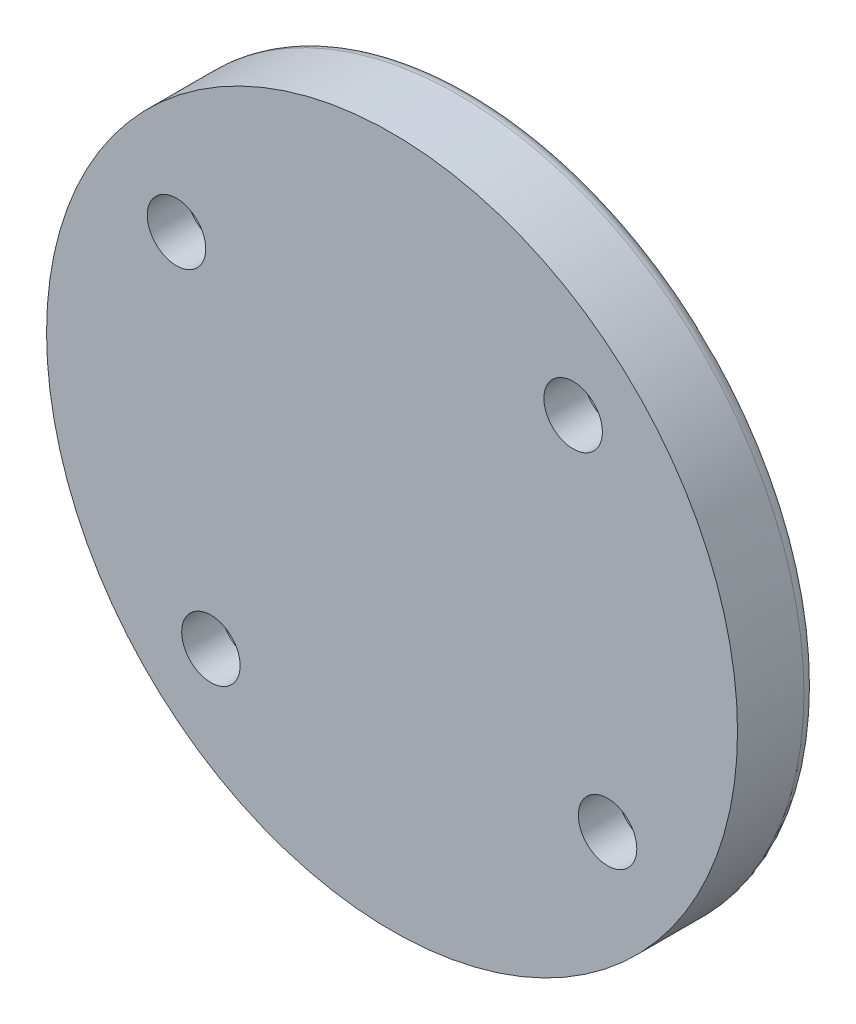
ISO-10303-21;
HEADER;
FILE_DESCRIPTION(('STEP AP214'),'2;1');
FILE_NAME('part.step','',(''),(''),'','','');
FILE_SCHEMA(('AUTOMOTIVE_DESIGN { 1 0 10303 214 1 1 1 1 }'));
ENDSEC;
DATA;
#1=APPLICATION_CONTEXT('core data for automotive mechanical design processes');
#2=APPLICATION_PROTOCOL_DEFINITION('international standard','automotive_design',2000,#1);
#3=PRODUCT_CONTEXT('',#1,'mechanical');
#4=PRODUCT('Part','Part','',(#3));
#5=PRODUCT_RELATED_PRODUCT_CATEGORY('part','',(#4));
#6=PRODUCT_DEFINITION_FORMATION('','',#4);
#7=PRODUCT_DEFINITION_CONTEXT('part definition',#1,'design');
#8=PRODUCT_DEFINITION('design','',#6,#7);
#9=PRODUCT_DEFINITION_SHAPE('','',#8);
#10=(LENGTH_UNIT() NAMED_UNIT(*) SI_UNIT(.MILLI.,.METRE.));
#11=(NAMED_UNIT(*) PLANE_ANGLE_UNIT() SI_UNIT($,.RADIAN.));
#12=(NAMED_UNIT(*) SI_UNIT($,.STERADIAN.) SOLID_ANGLE_UNIT());
#13=UNCERTAINTY_MEASURE_WITH_UNIT(LENGTH_MEASURE(1.E-05),#10,'distance_accuracy_value','');
#14=(GEOMETRIC_REPRESENTATION_CONTEXT(3) GLOBAL_UNCERTAINTY_ASSIGNED_CONTEXT((#13)) GLOBAL_UNIT_ASSIGNED_CONTEXT((#10,
#11,#12)) REPRESENTATION_CONTEXT('',''));
#15=CARTESIAN_POINT('',(0.,0.,0.));
#16=DIRECTION('',(0.,0.,1.));
#17=DIRECTION('',(1.,0.,0.));
#18=AXIS2_PLACEMENT_3D('',#15,#16,#17);
#19=CARTESIAN_POINT('',(59.9551309247938,-364.997907801492,3.));
#20=DIRECTION('',(0.,0.,-1.));
#21=DIRECTION('',(-1.,0.,0.));
#22=AXIS2_PLACEMENT_3D('',#19,#20,#21);
#23=CYLINDRICAL_SURFACE('',#22,1.10000000000004);
#24=CARTESIAN_POINT('',(59.9551309247938,-364.997907801492,3.));
#25=DIRECTION('',(0.,0.,1.));
#26=DIRECTION('',(1.,0.,0.));
#27=AXIS2_PLACEMENT_3D('',#24,#25,#26);
#28=CIRCLE('',#27,1.10000000000004);
#29=CARTESIAN_POINT('',(61.0551309247938,-364.997907801492,3.));
#30=VERTEX_POINT('',#29);
#31=EDGE_CURVE('E84',#30,#30,#28,.T.);
#32=ORIENTED_EDGE('',*,*,#31,.T.);
#33=EDGE_LOOP('',(#32));
#34=FACE_BOUND('',#33,.T.);
#35=CARTESIAN_POINT('',(59.9551309247938,-364.997907801492,1.5));
#36=DIRECTION('',(0.,0.,-1.));
#37=DIRECTION('',(-1.,0.,0.));
#38=AXIS2_PLACEMENT_3D('',#35,#36,#37);
#39=CIRCLE('',#38,1.10000000000004);
#40=CARTESIAN_POINT('',(58.8551309247938,-364.997907801492,1.5));
#41=VERTEX_POINT('',#40);
#42=EDGE_CURVE('E43',#41,#41,#39,.T.);
#43=ORIENTED_EDGE('',*,*,#42,.T.);
#44=EDGE_LOOP('',(#43));
#45=FACE_BOUND('',#44,.T.);
#46=ADVANCED_FACE('F39',(#34,#45),#23,.F.);
#47=CARTESIAN_POINT('',(74.8805104645125,-363.503569956376,3.));
#48=DIRECTION('',(0.,0.,-1.));
#49=DIRECTION('',(-1.,0.,0.));
#50=AXIS2_PLACEMENT_3D('',#47,#48,#49);
#51=CYLINDRICAL_SURFACE('',#50,1.10000000000008);
#52=CARTESIAN_POINT('',(74.8805104645125,-363.503569956376,3.));
#53=DIRECTION('',(0.,0.,1.));
#54=DIRECTION('',(1.,0.,0.));
#55=AXIS2_PLACEMENT_3D('',#52,#53,#54);
#56=CIRCLE('',#55,1.10000000000008);
#57=CARTESIAN_POINT('',(75.9805104645125,-363.503569956376,3.));
#58=VERTEX_POINT('',#57);
#59=EDGE_CURVE('E76',#58,#58,#56,.T.);
#60=ORIENTED_EDGE('',*,*,#59,.T.);
#61=EDGE_LOOP('',(#60));
#62=FACE_BOUND('',#61,.T.);
#63=CARTESIAN_POINT('',(74.8805104645125,-363.503569956376,1.5));
#64=DIRECTION('',(0.,0.,-1.));
#65=DIRECTION('',(-1.,0.,0.));
#66=AXIS2_PLACEMENT_3D('',#63,#64,#65);
#67=CIRCLE('',#66,1.10000000000008);
#68=CARTESIAN_POINT('',(73.7805104645124,-363.503569956376,1.5));
#69=VERTEX_POINT('',#68);
#70=EDGE_CURVE('E62',#69,#69,#67,.T.);
#71=ORIENTED_EDGE('',*,*,#70,.T.);
#72=EDGE_LOOP('',(#71));
#73=FACE_BOUND('',#72,.T.);
#74=ADVANCED_FACE('F106',(#62,#73),#51,.F.);
#75=CARTESIAN_POINT('',(58.6600381256929,-352.062578867069,3.));
#76=DIRECTION('',(0.,0.,-1.));
#77=DIRECTION('',(-1.,0.,0.));
#78=AXIS2_PLACEMENT_3D('',#75,#76,#77);
#79=CYLINDRICAL_SURFACE('',#78,1.09999999999998);
#80=CARTESIAN_POINT('',(58.6600381256929,-352.062578867069,3.));
#81=DIRECTION('',(0.,0.,1.));
#82=DIRECTION('',(1.,0.,0.));
#83=AXIS2_PLACEMENT_3D('',#80,#81,#82);
#84=CIRCLE('',#83,1.09999999999998);
#85=CARTESIAN_POINT('',(59.7600381256929,-352.062578867069,3.));
#86=VERTEX_POINT('',#85);
#87=EDGE_CURVE('E71',#86,#86,#84,.T.);
#88=ORIENTED_EDGE('',*,*,#87,.T.);
#89=EDGE_LOOP('',(#88));
#90=FACE_BOUND('',#89,.T.);
#91=CARTESIAN_POINT('',(58.6600381256929,-352.062578867069,1.5));
#92=DIRECTION('',(0.,0.,-1.));
#93=DIRECTION('',(-1.,0.,0.));
#94=AXIS2_PLACEMENT_3D('',#91,#92,#93);
#95=CIRCLE('',#94,1.09999999999998);
#96=CARTESIAN_POINT('',(57.5600381256929,-352.062578867069,1.5));
#97=VERTEX_POINT('',#96);
#98=EDGE_CURVE('E59',#97,#97,#95,.T.);
#99=ORIENTED_EDGE('',*,*,#98,.T.);
#100=EDGE_LOOP('',(#99));
#101=FACE_BOUND('',#100,.T.);
#102=ADVANCED_FACE('F112',(#90,#101),#79,.F.);
#103=CARTESIAN_POINT('',(73.5854176654116,-350.568241021953,3.));
#104=DIRECTION('',(0.,0.,-1.));
#105=DIRECTION('',(-1.,0.,0.));
#106=AXIS2_PLACEMENT_3D('',#103,#104,#105);
#107=CYLINDRICAL_SURFACE('',#106,1.10000000000004);
#108=CARTESIAN_POINT('',(73.5854176654116,-350.568241021953,3.));
#109=DIRECTION('',(0.,0.,1.));
#110=DIRECTION('',(1.,0.,0.));
#111=AXIS2_PLACEMENT_3D('',#108,#109,#110);
#112=CIRCLE('',#111,1.10000000000004);
#113=CARTESIAN_POINT('',(74.6854176654116,-350.568241021953,3.));
#114=VERTEX_POINT('',#113);
#115=EDGE_CURVE('E67',#114,#114,#112,.T.);
#116=ORIENTED_EDGE('',*,*,#115,.T.);
#117=EDGE_LOOP('',(#116));
#118=FACE_BOUND('',#117,.T.);
#119=CARTESIAN_POINT('',(73.5854176654116,-350.568241021953,1.5));
#120=DIRECTION('',(0.,0.,-1.));
#121=DIRECTION('',(-1.,0.,0.));
#122=AXIS2_PLACEMENT_3D('',#119,#120,#121);
#123=CIRCLE('',#122,1.10000000000004);
#124=CARTESIAN_POINT('',(72.4854176654116,-350.568241021953,1.5));
#125=VERTEX_POINT('',#124);
#126=EDGE_CURVE('E56',#125,#125,#123,.T.);
#127=ORIENTED_EDGE('',*,*,#126,.T.);
#128=EDGE_LOOP('',(#127));
#129=FACE_BOUND('',#128,.T.);
#130=ADVANCED_FACE('F117',(#118,#129),#107,.F.);
#131=CARTESIAN_POINT('',(66.7702742951027,-357.783074411722,3.));
#132=DIRECTION('',(0.,0.,1.));
#133=DIRECTION('',(1.,0.,0.));
#134=AXIS2_PLACEMENT_3D('',#131,#132,#133);
#135=PLANE('',#134);
#136=ORIENTED_EDGE('',*,*,#87,.F.);
#137=EDGE_LOOP('',(#136));
#138=FACE_BOUND('',#137,.T.);
#139=ORIENTED_EDGE('',*,*,#31,.F.);
#140=EDGE_LOOP('',(#139));
#141=FACE_BOUND('',#140,.T.);
#142=CARTESIAN_POINT('',(66.7702742951027,-357.783074411722,3.));
#143=DIRECTION('',(0.,0.,1.));
#144=DIRECTION('',(1.,0.,0.));
#145=AXIS2_PLACEMENT_3D('',#142,#143,#144);
#146=CIRCLE('',#145,13.);
#147=CARTESIAN_POINT('',(79.7702742951028,-357.783074411722,3.));
#148=VERTEX_POINT('',#147);
#149=EDGE_CURVE('E52',#148,#148,#146,.T.);
#150=ORIENTED_EDGE('',*,*,#149,.T.);
#151=EDGE_LOOP('',(#150));
#152=FACE_BOUND('',#151,.T.);
#153=ORIENTED_EDGE('',*,*,#59,.F.);
#154=EDGE_LOOP('',(#153));
#155=FACE_BOUND('',#154,.T.);
#156=ORIENTED_EDGE('',*,*,#115,.F.);
#157=EDGE_LOOP('',(#156));
#158=FACE_BOUND('',#157,.T.);
#159=ADVANCED_FACE('F89',(#138,#141,#152,#155,#158),#135,.T.);
#160=CARTESIAN_POINT('',(66.7702742951027,-357.783074411722,0.));
#161=DIRECTION('',(0.,0.,1.));
#162=DIRECTION('',(1.,0.,0.));
#163=AXIS2_PLACEMENT_3D('',#160,#161,#162);
#164=PLANE('',#163);
#165=CARTESIAN_POINT('',(74.8805104645125,-363.503569956376,0.));
#166=DIRECTION('',(0.,0.,-1.));
#167=DIRECTION('',(-1.,0.,0.));
#168=AXIS2_PLACEMENT_3D('',#165,#166,#167);
#169=CIRCLE('',#168,2.35);
#170=CARTESIAN_POINT('',(72.5305104645125,-363.503569956376,0.));
#171=VERTEX_POINT('',#170);
#172=EDGE_CURVE('E152',#171,#171,#169,.T.);
#173=ORIENTED_EDGE('',*,*,#172,.F.);
#174=EDGE_LOOP('',(#173));
#175=FACE_BOUND('',#174,.T.);
#176=CARTESIAN_POINT('',(59.9551309247938,-364.997907801492,0.));
#177=DIRECTION('',(0.,0.,-1.));
#178=DIRECTION('',(-1.,0.,0.));
#179=AXIS2_PLACEMENT_3D('',#176,#177,#178);
#180=CIRCLE('',#179,2.34999999999999);
#181=CARTESIAN_POINT('',(57.6051309247938,-364.997907801492,0.));
#182=VERTEX_POINT('',#181);
#183=EDGE_CURVE('E142',#182,#182,#180,.T.);
#184=ORIENTED_EDGE('',*,*,#183,.F.);
#185=EDGE_LOOP('',(#184));
#186=FACE_BOUND('',#185,.T.);
#187=CARTESIAN_POINT('',(58.6600381256929,-352.062578867069,0.));
#188=DIRECTION('',(0.,0.,-1.));
#189=DIRECTION('',(-1.,0.,0.));
#190=AXIS2_PLACEMENT_3D('',#187,#188,#189);
#191=CIRCLE('',#190,2.34999999999998);
#192=CARTESIAN_POINT('',(56.3100381256929,-352.062578867069,0.));
#193=VERTEX_POINT('',#192);
#194=EDGE_CURVE('E141',#193,#193,#191,.T.);
#195=ORIENTED_EDGE('',*,*,#194,.F.);
#196=EDGE_LOOP('',(#195));
#197=FACE_BOUND('',#196,.T.);
#198=CARTESIAN_POINT('',(73.5854176654116,-350.568241021953,0.));
#199=DIRECTION('',(0.,0.,-1.));
#200=DIRECTION('',(-1.,0.,0.));
#201=AXIS2_PLACEMENT_3D('',#198,#199,#200);
#202=CIRCLE('',#201,2.35);
#203=CARTESIAN_POINT('',(71.2354176654116,-350.568241021953,0.));
#204=VERTEX_POINT('',#203);
#205=EDGE_CURVE('E79',#204,#204,#202,.T.);
#206=ORIENTED_EDGE('',*,*,#205,.F.);
#207=EDGE_LOOP('',(#206));
#208=FACE_BOUND('',#207,.T.);
#209=CARTESIAN_POINT('',(66.7702742951027,-357.783074411722,0.));
#210=DIRECTION('',(0.,0.,1.));
#211=DIRECTION('',(1.,0.,0.));
#212=AXIS2_PLACEMENT_3D('',#209,#210,#211);
#213=CIRCLE('',#212,12.5);
#214=CARTESIAN_POINT('',(79.2702742951028,-357.783074411722,0.));
#215=VERTEX_POINT('',#214);
#216=EDGE_CURVE('E10',#215,#215,#213,.F.);
#217=ORIENTED_EDGE('',*,*,#216,.T.);
#218=EDGE_LOOP('',(#217));
#219=FACE_BOUND('',#218,.T.);
#220=ADVANCED_FACE('F94',(#175,#186,#197,#208,#219),#164,.F.);
#221=CARTESIAN_POINT('',(66.7702742951027,-357.783074411722,3.));
#222=DIRECTION('',(0.,0.,-1.));
#223=DIRECTION('',(-1.,0.,0.));
#224=AXIS2_PLACEMENT_3D('',#221,#222,#223);
#225=CYLINDRICAL_SURFACE('',#224,13.);
#226=CARTESIAN_POINT('',(66.7702742951027,-357.783074411722,0.5));
#227=DIRECTION('',(0.,0.,1.));
#228=DIRECTION('',(1.,0.,0.));
#229=AXIS2_PLACEMENT_3D('',#226,#227,#228);
#230=CIRCLE('',#229,13.);
#231=CARTESIAN_POINT('',(79.7702742951028,-357.783074411722,0.5));
#232=VERTEX_POINT('',#231);
#233=EDGE_CURVE('E47',#232,#232,#230,.T.);
#234=ORIENTED_EDGE('',*,*,#233,.T.);
#235=EDGE_LOOP('',(#234));
#236=FACE_BOUND('',#235,.T.);
#237=ORIENTED_EDGE('',*,*,#149,.F.);
#238=EDGE_LOOP('',(#237));
#239=FACE_BOUND('',#238,.T.);
#240=ADVANCED_FACE('F92',(#236,#239),#225,.T.);
#241=CARTESIAN_POINT('',(66.7702742951027,-357.783074411722,0.5));
#242=DIRECTION('',(0.,0.,1.));
#243=DIRECTION('',(1.,0.,0.));
#244=AXIS2_PLACEMENT_3D('',#241,#242,#243);
#245=TOROIDAL_SURFACE('',#244,12.5,0.5);
#246=ORIENTED_EDGE('',*,*,#216,.F.);
#247=EDGE_LOOP('',(#246));
#248=FACE_BOUND('',#247,.T.);
#249=ORIENTED_EDGE('',*,*,#233,.F.);
#250=EDGE_LOOP('',(#249));
#251=FACE_BOUND('',#250,.T.);
#252=ADVANCED_FACE('F41',(#248,#251),#245,.T.);
#253=CARTESIAN_POINT('',(73.5854176654116,-350.568241021953,1.5));
#254=DIRECTION('',(0.,0.,-1.));
#255=DIRECTION('',(-1.,0.,0.));
#256=AXIS2_PLACEMENT_3D('',#253,#254,#255);
#257=CYLINDRICAL_SURFACE('',#256,2.35);
#258=CARTESIAN_POINT('',(73.5854176654116,-350.568241021953,1.5));
#259=DIRECTION('',(0.,0.,-1.));
#260=DIRECTION('',(-1.,0.,0.));
#261=AXIS2_PLACEMENT_3D('',#258,#259,#260);
#262=CIRCLE('',#261,2.35);
#263=CARTESIAN_POINT('',(71.2354176654116,-350.568241021953,1.5));
#264=VERTEX_POINT('',#263);
#265=EDGE_CURVE('E60',#264,#264,#262,.T.);
#266=ORIENTED_EDGE('',*,*,#265,.F.);
#267=EDGE_LOOP('',(#266));
#268=FACE_BOUND('',#267,.T.);
#269=ORIENTED_EDGE('',*,*,#205,.T.);
#270=EDGE_LOOP('',(#269));
#271=FACE_BOUND('',#270,.T.);
#272=ADVANCED_FACE('F100',(#268,#271),#257,.F.);
#273=CARTESIAN_POINT('',(73.5854176654116,-350.568241021953,1.5));
#274=DIRECTION('',(0.,0.,-1.));
#275=DIRECTION('',(-1.,0.,0.));
#276=AXIS2_PLACEMENT_3D('',#273,#274,#275);
#277=PLANE('',#276);
#278=ORIENTED_EDGE('',*,*,#126,.F.);
#279=EDGE_LOOP('',(#278));
#280=FACE_BOUND('',#279,.T.);
#281=ORIENTED_EDGE('',*,*,#265,.T.);
#282=EDGE_LOOP('',(#281));
#283=FACE_BOUND('',#282,.T.);
#284=ADVANCED_FACE('F165',(#280,#283),#277,.T.);
#285=CARTESIAN_POINT('',(58.6600381256929,-352.062578867069,1.5));
#286=DIRECTION('',(0.,0.,-1.));
#287=DIRECTION('',(-1.,0.,0.));
#288=AXIS2_PLACEMENT_3D('',#285,#286,#287);
#289=CYLINDRICAL_SURFACE('',#288,2.34999999999998);
#290=CARTESIAN_POINT('',(58.6600381256929,-352.062578867069,1.5));
#291=DIRECTION('',(0.,0.,-1.));
#292=DIRECTION('',(-1.,0.,0.));
#293=AXIS2_PLACEMENT_3D('',#290,#291,#292);
#294=CIRCLE('',#293,2.34999999999998);
#295=CARTESIAN_POINT('',(56.3100381256929,-352.062578867069,1.5));
#296=VERTEX_POINT('',#295);
#297=EDGE_CURVE('E139',#296,#296,#294,.T.);
#298=ORIENTED_EDGE('',*,*,#297,.F.);
#299=EDGE_LOOP('',(#298));
#300=FACE_BOUND('',#299,.T.);
#301=ORIENTED_EDGE('',*,*,#194,.T.);
#302=EDGE_LOOP('',(#301));
#303=FACE_BOUND('',#302,.T.);
#304=ADVANCED_FACE('F135',(#300,#303),#289,.F.);
#305=CARTESIAN_POINT('',(58.6600381256929,-352.062578867069,1.5));
#306=DIRECTION('',(0.,0.,-1.));
#307=DIRECTION('',(-1.,0.,0.));
#308=AXIS2_PLACEMENT_3D('',#305,#306,#307);
#309=PLANE('',#308);
#310=ORIENTED_EDGE('',*,*,#98,.F.);
#311=EDGE_LOOP('',(#310));
#312=FACE_BOUND('',#311,.T.);
#313=ORIENTED_EDGE('',*,*,#297,.T.);
#314=EDGE_LOOP('',(#313));
#315=FACE_BOUND('',#314,.T.);
#316=ADVANCED_FACE('F131',(#312,#315),#309,.T.);
#317=CARTESIAN_POINT('',(74.8805104645125,-363.503569956376,1.5));
#318=DIRECTION('',(0.,0.,-1.));
#319=DIRECTION('',(-1.,0.,0.));
#320=AXIS2_PLACEMENT_3D('',#317,#318,#319);
#321=CYLINDRICAL_SURFACE('',#320,2.35);
#322=CARTESIAN_POINT('',(74.8805104645125,-363.503569956376,1.5));
#323=DIRECTION('',(0.,0.,-1.));
#324=DIRECTION('',(-1.,0.,0.));
#325=AXIS2_PLACEMENT_3D('',#322,#323,#324);
#326=CIRCLE('',#325,2.35);
#327=CARTESIAN_POINT('',(72.5305104645125,-363.503569956376,1.5));
#328=VERTEX_POINT('',#327);
#329=EDGE_CURVE('E155',#328,#328,#326,.T.);
#330=ORIENTED_EDGE('',*,*,#329,.F.);
#331=EDGE_LOOP('',(#330));
#332=FACE_BOUND('',#331,.T.);
#333=ORIENTED_EDGE('',*,*,#172,.T.);
#334=EDGE_LOOP('',(#333));
#335=FACE_BOUND('',#334,.T.);
#336=ADVANCED_FACE('F134',(#332,#335),#321,.F.);
#337=CARTESIAN_POINT('',(74.8805104645125,-363.503569956376,1.5));
#338=DIRECTION('',(0.,0.,-1.));
#339=DIRECTION('',(-1.,0.,0.));
#340=AXIS2_PLACEMENT_3D('',#337,#338,#339);
#341=PLANE('',#340);
#342=ORIENTED_EDGE('',*,*,#70,.F.);
#343=EDGE_LOOP('',(#342));
#344=FACE_BOUND('',#343,.T.);
#345=ORIENTED_EDGE('',*,*,#329,.T.);
#346=EDGE_LOOP('',(#345));
#347=FACE_BOUND('',#346,.T.);
#348=ADVANCED_FACE('F174',(#344,#347),#341,.T.);
#349=CARTESIAN_POINT('',(59.9551309247938,-364.997907801492,1.5));
#350=DIRECTION('',(0.,0.,-1.));
#351=DIRECTION('',(-1.,0.,0.));
#352=AXIS2_PLACEMENT_3D('',#349,#350,#351);
#353=CYLINDRICAL_SURFACE('',#352,2.34999999999999);
#354=CARTESIAN_POINT('',(59.9551309247938,-364.997907801492,1.5));
#355=DIRECTION('',(0.,0.,-1.));
#356=DIRECTION('',(-1.,0.,0.));
#357=AXIS2_PLACEMENT_3D('',#354,#355,#356);
#358=CIRCLE('',#357,2.34999999999999);
#359=CARTESIAN_POINT('',(57.6051309247938,-364.997907801492,1.5));
#360=VERTEX_POINT('',#359);
#361=EDGE_CURVE('E147',#360,#360,#358,.T.);
#362=ORIENTED_EDGE('',*,*,#361,.F.);
#363=EDGE_LOOP('',(#362));
#364=FACE_BOUND('',#363,.T.);
#365=ORIENTED_EDGE('',*,*,#183,.T.);
#366=EDGE_LOOP('',(#365));
#367=FACE_BOUND('',#366,.T.);
#368=ADVANCED_FACE('F177',(#364,#367),#353,.F.);
#369=CARTESIAN_POINT('',(59.9551309247938,-364.997907801492,1.5));
#370=DIRECTION('',(0.,0.,-1.));
#371=DIRECTION('',(-1.,0.,0.));
#372=AXIS2_PLACEMENT_3D('',#369,#370,#371);
#373=PLANE('',#372);
#374=ORIENTED_EDGE('',*,*,#42,.F.);
#375=EDGE_LOOP('',(#374));
#376=FACE_BOUND('',#375,.T.);
#377=ORIENTED_EDGE('',*,*,#361,.T.);
#378=EDGE_LOOP('',(#377));
#379=FACE_BOUND('',#378,.T.);
#380=ADVANCED_FACE('F182',(#376,#379),#373,.T.);
#381=CLOSED_SHELL('',(#46,#74,#102,#130,#159,#220,#240,#252,#272,#284,#304,#316,#336,#348,#368,#380));
#382=MANIFOLD_SOLID_BREP('B2',#381);
#383=ADVANCED_BREP_SHAPE_REPRESENTATION('',(#18,#382),#14);
#384=SHAPE_DEFINITION_REPRESENTATION(#9,#383);
ENDSEC;
END-ISO-10303-21;
